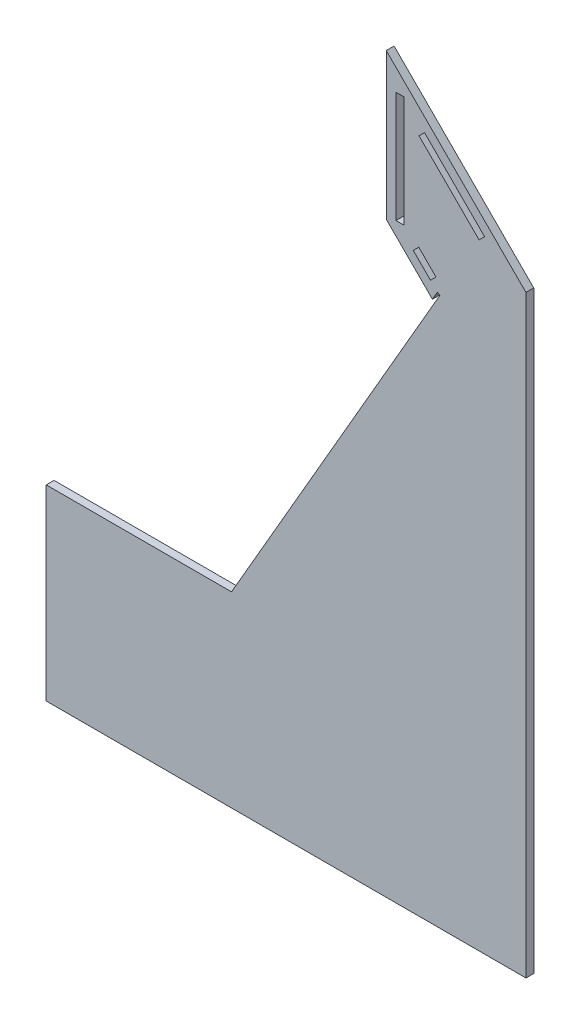
ISO-10303-21;
HEADER;
FILE_DESCRIPTION(('STEP AP214'),'2;1');
FILE_NAME('part.step','',(''),(''),'','','');
FILE_SCHEMA(('AUTOMOTIVE_DESIGN { 1 0 10303 214 1 1 1 1 }'));
ENDSEC;
DATA;
#1=APPLICATION_CONTEXT('core data for automotive mechanical design processes');
#2=APPLICATION_PROTOCOL_DEFINITION('international standard','automotive_design',2000,#1);
#3=PRODUCT_CONTEXT('',#1,'mechanical');
#4=PRODUCT('Part','Part','',(#3));
#5=PRODUCT_RELATED_PRODUCT_CATEGORY('part','',(#4));
#6=PRODUCT_DEFINITION_FORMATION('','',#4);
#7=PRODUCT_DEFINITION_CONTEXT('part definition',#1,'design');
#8=PRODUCT_DEFINITION('design','',#6,#7);
#9=PRODUCT_DEFINITION_SHAPE('','',#8);
#10=(LENGTH_UNIT() NAMED_UNIT(*) SI_UNIT(.MILLI.,.METRE.));
#11=(NAMED_UNIT(*) PLANE_ANGLE_UNIT() SI_UNIT($,.RADIAN.));
#12=(NAMED_UNIT(*) SI_UNIT($,.STERADIAN.) SOLID_ANGLE_UNIT());
#13=UNCERTAINTY_MEASURE_WITH_UNIT(LENGTH_MEASURE(1.E-05),#10,'distance_accuracy_value','');
#14=(GEOMETRIC_REPRESENTATION_CONTEXT(3) GLOBAL_UNCERTAINTY_ASSIGNED_CONTEXT((#13)) GLOBAL_UNIT_ASSIGNED_CONTEXT((#10,
#11,#12)) REPRESENTATION_CONTEXT('',''));
#15=CARTESIAN_POINT('',(0.,0.,0.));
#16=DIRECTION('',(0.,0.,1.));
#17=DIRECTION('',(1.,0.,0.));
#18=AXIS2_PLACEMENT_3D('',#15,#16,#17);
#19=CARTESIAN_POINT('',(56.7634850254111,-32.7724133595535,8.));
#20=DIRECTION('',(0.866025403784497,-0.499999999999898,0.));
#21=DIRECTION('',(0.499999999999898,0.866025403784498,0.));
#22=AXIS2_PLACEMENT_3D('',#19,#20,#21);
#23=PLANE('',#22);
#24=DIRECTION('',(-0.499999999999898,-0.866025403784497,0.));
#25=VECTOR('',#24,1.);
#26=CARTESIAN_POINT('',(56.7634850254111,-32.7724133595535,0.));
#27=LINE('',#26,#25);
#28=CARTESIAN_POINT('',(401.154700619023,563.730669729152,0.));
#29=VERTEX_POINT('',#28);
#30=CARTESIAN_POINT('',(396.053847577291,554.895733098927,0.));
#31=VERTEX_POINT('',#30);
#32=EDGE_CURVE('E261',#29,#31,#27,.T.);
#33=ORIENTED_EDGE('',*,*,#32,.F.);
#34=DIRECTION('',(0.,0.,-1.));
#35=VECTOR('',#34,1.);
#36=CARTESIAN_POINT('',(401.154700619023,563.730669729152,8.));
#37=LINE('',#36,#35);
#38=CARTESIAN_POINT('',(401.154700619023,563.730669729152,8.));
#39=VERTEX_POINT('',#38);
#40=EDGE_CURVE('E11',#39,#29,#37,.T.);
#41=ORIENTED_EDGE('',*,*,#40,.F.);
#42=DIRECTION('',(-0.499999999999898,-0.866025403784497,0.));
#43=VECTOR('',#42,1.);
#44=CARTESIAN_POINT('',(56.7634850254111,-32.7724133595535,8.));
#45=LINE('',#44,#43);
#46=CARTESIAN_POINT('',(396.053847577291,554.895733098927,8.));
#47=VERTEX_POINT('',#46);
#48=EDGE_CURVE('E370',#39,#47,#45,.T.);
#49=ORIENTED_EDGE('',*,*,#48,.T.);
#50=DIRECTION('',(0.,0.,-1.));
#51=VECTOR('',#50,1.);
#52=CARTESIAN_POINT('',(396.053847577291,554.895733098927,8.));
#53=LINE('',#52,#51);
#54=EDGE_CURVE('E60',#47,#31,#53,.T.);
#55=ORIENTED_EDGE('',*,*,#54,.T.);
#56=EDGE_LOOP('',(#33,#41,#49,#55));
#57=FACE_BOUND('',#56,.T.);
#58=ADVANCED_FACE('F41',(#57),#23,.T.);
#59=CARTESIAN_POINT('',(344.39121559369,596.50308308867,8.));
#60=DIRECTION('',(-0.500000000000005,-0.866025403784436,0.));
#61=DIRECTION('',(0.866025403784436,-0.500000000000005,0.));
#62=AXIS2_PLACEMENT_3D('',#59,#60,#61);
#63=PLANE('',#62);
#64=DIRECTION('',(-0.866025403784436,0.500000000000005,0.));
#65=VECTOR('',#64,1.);
#66=CARTESIAN_POINT('',(344.39121559369,596.50308308867,0.));
#67=LINE('',#66,#65);
#68=CARTESIAN_POINT('',(403.752776830379,562.23066972915,0.));
#69=VERTEX_POINT('',#68);
#70=EDGE_CURVE('E263',#69,#29,#67,.T.);
#71=ORIENTED_EDGE('',*,*,#70,.F.);
#72=DIRECTION('',(0.,0.,-1.));
#73=VECTOR('',#72,1.);
#74=CARTESIAN_POINT('',(403.752776830379,562.23066972915,8.));
#75=LINE('',#74,#73);
#76=CARTESIAN_POINT('',(403.752776830379,562.23066972915,8.));
#77=VERTEX_POINT('',#76);
#78=EDGE_CURVE('E51',#77,#69,#75,.T.);
#79=ORIENTED_EDGE('',*,*,#78,.F.);
#80=DIRECTION('',(-0.866025403784436,0.500000000000005,0.));
#81=VECTOR('',#80,1.);
#82=CARTESIAN_POINT('',(344.39121559369,596.50308308867,8.));
#83=LINE('',#82,#81);
#84=EDGE_CURVE('E372',#77,#39,#83,.T.);
#85=ORIENTED_EDGE('',*,*,#84,.T.);
#86=ORIENTED_EDGE('',*,*,#40,.T.);
#87=EDGE_LOOP('',(#71,#79,#85,#86));
#88=FACE_BOUND('',#87,.T.);
#89=ADVANCED_FACE('F404',(#88),#63,.T.);
#90=CARTESIAN_POINT('',(59.3615612366916,-34.2724133595205,8.));
#91=DIRECTION('',(-0.866025403784438,0.500000000000002,0.));
#92=DIRECTION('',(-0.500000000000002,-0.866025403784438,0.));
#93=AXIS2_PLACEMENT_3D('',#90,#91,#92);
#94=PLANE('',#93);
#95=DIRECTION('',(0.500000000000002,0.866025403784438,0.));
#96=VECTOR('',#95,1.);
#97=CARTESIAN_POINT('',(59.3615612366916,-34.2724133595205,0.));
#98=LINE('',#97,#96);
#99=CARTESIAN_POINT('',(190.,192.,0.));
#100=VERTEX_POINT('',#99);
#101=EDGE_CURVE('E266',#100,#69,#98,.T.);
#102=ORIENTED_EDGE('',*,*,#101,.F.);
#103=DIRECTION('',(0.,0.,-1.));
#104=VECTOR('',#103,1.);
#105=CARTESIAN_POINT('',(190.,192.,8.));
#106=LINE('',#105,#104);
#107=CARTESIAN_POINT('',(190.,192.,8.));
#108=VERTEX_POINT('',#107);
#109=EDGE_CURVE('E298',#108,#100,#106,.T.);
#110=ORIENTED_EDGE('',*,*,#109,.F.);
#111=DIRECTION('',(0.500000000000002,0.866025403784438,0.));
#112=VECTOR('',#111,1.);
#113=CARTESIAN_POINT('',(59.3615612366916,-34.2724133595205,8.));
#114=LINE('',#113,#112);
#115=EDGE_CURVE('E375',#108,#77,#114,.T.);
#116=ORIENTED_EDGE('',*,*,#115,.T.);
#117=ORIENTED_EDGE('',*,*,#78,.T.);
#118=EDGE_LOOP('',(#102,#110,#116,#117));
#119=FACE_BOUND('',#118,.T.);
#120=ADVANCED_FACE('F409',(#119),#94,.T.);
#121=CARTESIAN_POINT('',(0.,192.,8.));
#122=DIRECTION('',(0.,1.,0.));
#123=DIRECTION('',(0.,0.,1.));
#124=AXIS2_PLACEMENT_3D('',#121,#122,#123);
#125=PLANE('',#124);
#126=DIRECTION('',(1.,0.,0.));
#127=VECTOR('',#126,1.);
#128=CARTESIAN_POINT('',(0.,192.,0.));
#129=LINE('',#128,#127);
#130=CARTESIAN_POINT('',(0.,192.,0.));
#131=VERTEX_POINT('',#130);
#132=EDGE_CURVE('E269',#131,#100,#129,.T.);
#133=ORIENTED_EDGE('',*,*,#132,.F.);
#134=DIRECTION('',(0.,0.,-1.));
#135=VECTOR('',#134,1.);
#136=CARTESIAN_POINT('',(0.,192.,8.));
#137=LINE('',#136,#135);
#138=CARTESIAN_POINT('',(0.,192.,8.));
#139=VERTEX_POINT('',#138);
#140=EDGE_CURVE('E296',#139,#131,#137,.T.);
#141=ORIENTED_EDGE('',*,*,#140,.F.);
#142=DIRECTION('',(1.,0.,0.));
#143=VECTOR('',#142,1.);
#144=CARTESIAN_POINT('',(0.,192.,8.));
#145=LINE('',#144,#143);
#146=EDGE_CURVE('E378',#139,#108,#145,.T.);
#147=ORIENTED_EDGE('',*,*,#146,.T.);
#148=ORIENTED_EDGE('',*,*,#109,.T.);
#149=EDGE_LOOP('',(#133,#141,#147,#148));
#150=FACE_BOUND('',#149,.T.);
#151=ADVANCED_FACE('F519',(#150),#125,.T.);
#152=CARTESIAN_POINT('',(0.,0.,8.));
#153=DIRECTION('',(-1.,0.,0.));
#154=DIRECTION('',(0.,0.,1.));
#155=AXIS2_PLACEMENT_3D('',#152,#153,#154);
#156=PLANE('',#155);
#157=DIRECTION('',(0.,1.,0.));
#158=VECTOR('',#157,1.);
#159=CARTESIAN_POINT('',(0.,0.,0.));
#160=LINE('',#159,#158);
#161=CARTESIAN_POINT('',(0.,0.,0.));
#162=VERTEX_POINT('',#161);
#163=EDGE_CURVE('E272',#162,#131,#160,.T.);
#164=ORIENTED_EDGE('',*,*,#163,.F.);
#165=DIRECTION('',(0.,0.,-1.));
#166=VECTOR('',#165,1.);
#167=CARTESIAN_POINT('',(0.,0.,8.));
#168=LINE('',#167,#166);
#169=CARTESIAN_POINT('',(0.,0.,8.));
#170=VERTEX_POINT('',#169);
#171=EDGE_CURVE('E294',#170,#162,#168,.T.);
#172=ORIENTED_EDGE('',*,*,#171,.F.);
#173=DIRECTION('',(0.,1.,0.));
#174=VECTOR('',#173,1.);
#175=CARTESIAN_POINT('',(0.,0.,8.));
#176=LINE('',#175,#174);
#177=EDGE_CURVE('E381',#170,#139,#176,.T.);
#178=ORIENTED_EDGE('',*,*,#177,.T.);
#179=ORIENTED_EDGE('',*,*,#140,.T.);
#180=EDGE_LOOP('',(#164,#172,#178,#179));
#181=FACE_BOUND('',#180,.T.);
#182=ADVANCED_FACE('F510',(#181),#156,.T.);
#183=CARTESIAN_POINT('',(0.,0.,8.));
#184=DIRECTION('',(0.,1.,0.));
#185=DIRECTION('',(0.,0.,1.));
#186=AXIS2_PLACEMENT_3D('',#183,#184,#185);
#187=PLANE('',#186);
#188=DIRECTION('',(1.,0.,0.));
#189=VECTOR('',#188,1.);
#190=CARTESIAN_POINT('',(0.,0.,0.));
#191=LINE('',#190,#189);
#192=CARTESIAN_POINT('',(492.,0.,0.));
#193=VERTEX_POINT('',#192);
#194=EDGE_CURVE('E275',#162,#193,#191,.T.);
#195=ORIENTED_EDGE('',*,*,#194,.T.);
#196=DIRECTION('',(0.,0.,-1.));
#197=VECTOR('',#196,1.);
#198=CARTESIAN_POINT('',(492.,0.,8.));
#199=LINE('',#198,#197);
#200=CARTESIAN_POINT('',(492.,0.,8.));
#201=VERTEX_POINT('',#200);
#202=EDGE_CURVE('E292',#201,#193,#199,.T.);
#203=ORIENTED_EDGE('',*,*,#202,.F.);
#204=DIRECTION('',(1.,0.,0.));
#205=VECTOR('',#204,1.);
#206=CARTESIAN_POINT('',(0.,0.,8.));
#207=LINE('',#206,#205);
#208=EDGE_CURVE('E384',#170,#201,#207,.T.);
#209=ORIENTED_EDGE('',*,*,#208,.F.);
#210=ORIENTED_EDGE('',*,*,#171,.T.);
#211=EDGE_LOOP('',(#195,#203,#209,#210));
#212=FACE_BOUND('',#211,.T.);
#213=ADVANCED_FACE('F502',(#212),#187,.F.);
#214=CARTESIAN_POINT('',(492.,0.,8.));
#215=DIRECTION('',(1.,0.,0.));
#216=DIRECTION('',(0.,1.,0.));
#217=AXIS2_PLACEMENT_3D('',#214,#215,#216);
#218=PLANE('',#217);
#219=DIRECTION('',(0.,-1.,0.));
#220=VECTOR('',#219,1.);
#221=CARTESIAN_POINT('',(492.,0.,0.));
#222=LINE('',#221,#220);
#223=CARTESIAN_POINT('',(492.,608.94958067622,0.));
#224=VERTEX_POINT('',#223);
#225=EDGE_CURVE('E278',#224,#193,#222,.T.);
#226=ORIENTED_EDGE('',*,*,#225,.F.);
#227=DIRECTION('',(0.,0.,-1.));
#228=VECTOR('',#227,1.);
#229=CARTESIAN_POINT('',(492.,608.94958067622,8.));
#230=LINE('',#229,#228);
#231=CARTESIAN_POINT('',(492.,608.94958067622,8.));
#232=VERTEX_POINT('',#231);
#233=EDGE_CURVE('E206',#232,#224,#230,.T.);
#234=ORIENTED_EDGE('',*,*,#233,.F.);
#235=DIRECTION('',(0.,-1.,0.));
#236=VECTOR('',#235,1.);
#237=CARTESIAN_POINT('',(492.,0.,8.));
#238=LINE('',#237,#236);
#239=EDGE_CURVE('E216',#232,#201,#238,.T.);
#240=ORIENTED_EDGE('',*,*,#239,.T.);
#241=ORIENTED_EDGE('',*,*,#202,.T.);
#242=EDGE_LOOP('',(#226,#234,#240,#241));
#243=FACE_BOUND('',#242,.T.);
#244=ADVANCED_FACE('F387',(#243),#218,.T.);
#245=CARTESIAN_POINT('',(550.474790338107,550.474790338113,8.));
#246=DIRECTION('',(0.707106781186543,0.707106781186552,0.));
#247=DIRECTION('',(-0.707106781186552,0.707106781186543,0.));
#248=AXIS2_PLACEMENT_3D('',#245,#246,#247);
#249=PLANE('',#248);
#250=DIRECTION('',(0.707106781186552,-0.707106781186543,0.));
#251=VECTOR('',#250,1.);
#252=CARTESIAN_POINT('',(550.474790338107,550.474790338113,0.));
#253=LINE('',#252,#251);
#254=CARTESIAN_POINT('',(348.75252531694,752.197055359277,0.));
#255=VERTEX_POINT('',#254);
#256=EDGE_CURVE('E202',#255,#224,#253,.T.);
#257=ORIENTED_EDGE('',*,*,#256,.F.);
#258=DIRECTION('',(0.,0.,-1.));
#259=VECTOR('',#258,1.);
#260=CARTESIAN_POINT('',(348.75252531694,752.197055359277,8.));
#261=LINE('',#260,#259);
#262=CARTESIAN_POINT('',(348.75252531694,752.197055359277,8.));
#263=VERTEX_POINT('',#262);
#264=EDGE_CURVE('E197',#263,#255,#261,.T.);
#265=ORIENTED_EDGE('',*,*,#264,.F.);
#266=DIRECTION('',(0.707106781186552,-0.707106781186543,0.));
#267=VECTOR('',#266,1.);
#268=CARTESIAN_POINT('',(550.474790338107,550.474790338113,8.));
#269=LINE('',#268,#267);
#270=EDGE_CURVE('E200',#263,#232,#269,.T.);
#271=ORIENTED_EDGE('',*,*,#270,.T.);
#272=ORIENTED_EDGE('',*,*,#233,.T.);
#273=EDGE_LOOP('',(#257,#265,#271,#272));
#274=FACE_BOUND('',#273,.T.);
#275=ADVANCED_FACE('F199',(#274),#249,.T.);
#276=CARTESIAN_POINT('',(348.75252531694,0.,8.));
#277=DIRECTION('',(-1.,0.,0.));
#278=DIRECTION('',(0.,0.,1.));
#279=AXIS2_PLACEMENT_3D('',#276,#277,#278);
#280=PLANE('',#279);
#281=DIRECTION('',(0.,1.,0.));
#282=VECTOR('',#281,1.);
#283=CARTESIAN_POINT('',(348.75252531694,0.,0.));
#284=LINE('',#283,#282);
#285=CARTESIAN_POINT('',(348.752525316941,602.197055359277,0.));
#286=VERTEX_POINT('',#285);
#287=EDGE_CURVE('E282',#286,#255,#284,.T.);
#288=ORIENTED_EDGE('',*,*,#287,.F.);
#289=DIRECTION('',(0.,0.,-1.));
#290=VECTOR('',#289,1.);
#291=CARTESIAN_POINT('',(348.752525316941,602.197055359277,8.));
#292=LINE('',#291,#290);
#293=CARTESIAN_POINT('',(348.752525316941,602.197055359277,8.));
#294=VERTEX_POINT('',#293);
#295=EDGE_CURVE('E127',#294,#286,#292,.T.);
#296=ORIENTED_EDGE('',*,*,#295,.F.);
#297=DIRECTION('',(0.,1.,0.));
#298=VECTOR('',#297,1.);
#299=CARTESIAN_POINT('',(348.75252531694,0.,8.));
#300=LINE('',#299,#298);
#301=EDGE_CURVE('E214',#294,#263,#300,.T.);
#302=ORIENTED_EDGE('',*,*,#301,.T.);
#303=ORIENTED_EDGE('',*,*,#264,.T.);
#304=EDGE_LOOP('',(#288,#296,#302,#303));
#305=FACE_BOUND('',#304,.T.);
#306=ADVANCED_FACE('F218',(#305),#280,.T.);
#307=CARTESIAN_POINT('',(-106.036721896597,106.036721896597,8.));
#308=DIRECTION('',(0.707106781186547,-0.707106781186547,0.));
#309=DIRECTION('',(0.707106781186548,0.707106781186548,0.));
#310=AXIS2_PLACEMENT_3D('',#307,#308,#309);
#311=PLANE('',#310);
#312=DIRECTION('',(-0.707106781186548,-0.707106781186548,0.));
#313=VECTOR('',#312,1.);
#314=CARTESIAN_POINT('',(-106.036721896597,106.036721896597,0.));
#315=LINE('',#314,#313);
#316=CARTESIAN_POINT('',(382.062817526977,594.13626132017,0.));
#317=VERTEX_POINT('',#316);
#318=CARTESIAN_POINT('',(376.405963277485,588.479407070678,0.));
#319=VERTEX_POINT('',#318);
#320=EDGE_CURVE('E249',#317,#319,#315,.T.);
#321=ORIENTED_EDGE('',*,*,#320,.F.);
#322=DIRECTION('',(0.,0.,-1.));
#323=VECTOR('',#322,1.);
#324=CARTESIAN_POINT('',(382.062817526977,594.13626132017,8.));
#325=LINE('',#324,#323);
#326=CARTESIAN_POINT('',(382.062817526977,594.13626132017,8.));
#327=VERTEX_POINT('',#326);
#328=EDGE_CURVE('E289',#327,#317,#325,.T.);
#329=ORIENTED_EDGE('',*,*,#328,.F.);
#330=DIRECTION('',(-0.707106781186548,-0.707106781186548,0.));
#331=VECTOR('',#330,1.);
#332=CARTESIAN_POINT('',(-106.036721896597,106.036721896597,8.));
#333=LINE('',#332,#331);
#334=CARTESIAN_POINT('',(376.405963277485,588.479407070678,8.));
#335=VERTEX_POINT('',#334);
#336=EDGE_CURVE('E358',#327,#335,#333,.T.);
#337=ORIENTED_EDGE('',*,*,#336,.T.);
#338=DIRECTION('',(0.,0.,-1.));
#339=VECTOR('',#338,1.);
#340=CARTESIAN_POINT('',(376.405963277485,588.479407070678,8.));
#341=LINE('',#340,#339);
#342=EDGE_CURVE('E301',#335,#319,#341,.T.);
#343=ORIENTED_EDGE('',*,*,#342,.T.);
#344=EDGE_LOOP('',(#321,#329,#337,#343));
#345=FACE_BOUND('',#344,.T.);
#346=ADVANCED_FACE('F426',(#345),#311,.T.);
#347=CARTESIAN_POINT('',(488.099539423571,488.099539423578,8.));
#348=DIRECTION('',(-0.707106781186542,-0.707106781186553,0.));
#349=DIRECTION('',(0.707106781186553,-0.707106781186542,0.));
#350=AXIS2_PLACEMENT_3D('',#347,#348,#349);
#351=PLANE('',#350);
#352=DIRECTION('',(-0.707106781186553,0.707106781186542,0.));
#353=VECTOR('',#352,1.);
#354=CARTESIAN_POINT('',(488.099539423571,488.099539423578,0.));
#355=LINE('',#354,#353);
#356=CARTESIAN_POINT('',(399.740487056641,576.458591790507,0.));
#357=VERTEX_POINT('',#356);
#358=EDGE_CURVE('E252',#357,#317,#355,.T.);
#359=ORIENTED_EDGE('',*,*,#358,.F.);
#360=DIRECTION('',(0.,0.,-1.));
#361=VECTOR('',#360,1.);
#362=CARTESIAN_POINT('',(399.740487056641,576.458591790507,8.));
#363=LINE('',#362,#361);
#364=CARTESIAN_POINT('',(399.740487056641,576.458591790507,8.));
#365=VERTEX_POINT('',#364);
#366=EDGE_CURVE('E306',#365,#357,#363,.T.);
#367=ORIENTED_EDGE('',*,*,#366,.F.);
#368=DIRECTION('',(-0.707106781186553,0.707106781186542,0.));
#369=VECTOR('',#368,1.);
#370=CARTESIAN_POINT('',(488.099539423571,488.099539423578,8.));
#371=LINE('',#370,#369);
#372=EDGE_CURVE('E361',#365,#327,#371,.T.);
#373=ORIENTED_EDGE('',*,*,#372,.T.);
#374=ORIENTED_EDGE('',*,*,#328,.T.);
#375=EDGE_LOOP('',(#359,#367,#373,#374));
#376=FACE_BOUND('',#375,.T.);
#377=ADVANCED_FACE('F422',(#376),#351,.T.);
#378=CARTESIAN_POINT('',(-88.359052366929,88.3590523669273,8.));
#379=DIRECTION('',(-0.707106781186554,0.707106781186541,0.));
#380=DIRECTION('',(-0.707106781186541,-0.707106781186554,0.));
#381=AXIS2_PLACEMENT_3D('',#378,#379,#380);
#382=PLANE('',#381);
#383=DIRECTION('',(0.707106781186541,0.707106781186554,0.));
#384=VECTOR('',#383,1.);
#385=CARTESIAN_POINT('',(-88.359052366929,88.3590523669273,0.));
#386=LINE('',#385,#384);
#387=CARTESIAN_POINT('',(394.083632807149,570.801737541014,0.));
#388=VERTEX_POINT('',#387);
#389=EDGE_CURVE('E255',#388,#357,#386,.T.);
#390=ORIENTED_EDGE('',*,*,#389,.F.);
#391=DIRECTION('',(0.,0.,-1.));
#392=VECTOR('',#391,1.);
#393=CARTESIAN_POINT('',(394.083632807149,570.801737541014,8.));
#394=LINE('',#393,#392);
#395=CARTESIAN_POINT('',(394.083632807149,570.801737541014,8.));
#396=VERTEX_POINT('',#395);
#397=EDGE_CURVE('E303',#396,#388,#394,.T.);
#398=ORIENTED_EDGE('',*,*,#397,.F.);
#399=DIRECTION('',(0.707106781186541,0.707106781186554,0.));
#400=VECTOR('',#399,1.);
#401=CARTESIAN_POINT('',(-88.359052366929,88.3590523669273,8.));
#402=LINE('',#401,#400);
#403=EDGE_CURVE('E364',#396,#365,#402,.T.);
#404=ORIENTED_EDGE('',*,*,#403,.T.);
#405=ORIENTED_EDGE('',*,*,#366,.T.);
#406=EDGE_LOOP('',(#390,#398,#404,#405));
#407=FACE_BOUND('',#406,.T.);
#408=ADVANCED_FACE('F418',(#407),#382,.T.);
#409=CARTESIAN_POINT('',(0.,606.157076600346,8.));
#410=DIRECTION('',(0.,1.,0.));
#411=DIRECTION('',(0.,0.,1.));
#412=AXIS2_PLACEMENT_3D('',#409,#410,#411);
#413=PLANE('',#412);
#414=DIRECTION('',(1.,0.,0.));
#415=VECTOR('',#414,1.);
#416=CARTESIAN_POINT('',(0.,606.157076600346,0.));
#417=LINE('',#416,#415);
#418=CARTESIAN_POINT('',(358.728293747834,606.157076600346,0.));
#419=VERTEX_POINT('',#418);
#420=CARTESIAN_POINT('',(366.728293747835,606.157076600346,0.));
#421=VERTEX_POINT('',#420);
#422=EDGE_CURVE('E237',#419,#421,#417,.T.);
#423=ORIENTED_EDGE('',*,*,#422,.F.);
#424=DIRECTION('',(0.,0.,-1.));
#425=VECTOR('',#424,1.);
#426=CARTESIAN_POINT('',(358.728293747834,606.157076600346,8.));
#427=LINE('',#426,#425);
#428=CARTESIAN_POINT('',(358.728293747834,606.157076600346,8.));
#429=VERTEX_POINT('',#428);
#430=EDGE_CURVE('E304',#429,#419,#427,.T.);
#431=ORIENTED_EDGE('',*,*,#430,.F.);
#432=DIRECTION('',(1.,0.,0.));
#433=VECTOR('',#432,1.);
#434=CARTESIAN_POINT('',(0.,606.157076600346,8.));
#435=LINE('',#434,#433);
#436=CARTESIAN_POINT('',(366.728293747835,606.157076600346,8.));
#437=VERTEX_POINT('',#436);
#438=EDGE_CURVE('E343',#429,#437,#435,.T.);
#439=ORIENTED_EDGE('',*,*,#438,.T.);
#440=DIRECTION('',(0.,0.,-1.));
#441=VECTOR('',#440,1.);
#442=CARTESIAN_POINT('',(366.728293747835,606.157076600346,8.));
#443=LINE('',#442,#441);
#444=EDGE_CURVE('E309',#437,#421,#443,.T.);
#445=ORIENTED_EDGE('',*,*,#444,.T.);
#446=EDGE_LOOP('',(#423,#431,#439,#445));
#447=FACE_BOUND('',#446,.T.);
#448=ADVANCED_FACE('F421',(#447),#413,.T.);
#449=CARTESIAN_POINT('',(358.728293747833,-1.04871871667693E-12,8.));
#450=DIRECTION('',(1.,0.,0.));
#451=DIRECTION('',(0.,1.,0.));
#452=AXIS2_PLACEMENT_3D('',#449,#450,#451);
#453=PLANE('',#452);
#454=DIRECTION('',(0.,-1.,0.));
#455=VECTOR('',#454,1.);
#456=CARTESIAN_POINT('',(358.728293747833,-1.04871871667693E-12,0.));
#457=LINE('',#456,#455);
#458=CARTESIAN_POINT('',(358.728293747835,720.087076600346,0.));
#459=VERTEX_POINT('',#458);
#460=EDGE_CURVE('E240',#459,#419,#457,.T.);
#461=ORIENTED_EDGE('',*,*,#460,.F.);
#462=DIRECTION('',(0.,0.,-1.));
#463=VECTOR('',#462,1.);
#464=CARTESIAN_POINT('',(358.728293747835,720.087076600346,8.));
#465=LINE('',#464,#463);
#466=CARTESIAN_POINT('',(358.728293747835,720.087076600346,8.));
#467=VERTEX_POINT('',#466);
#468=EDGE_CURVE('E313',#467,#459,#465,.T.);
#469=ORIENTED_EDGE('',*,*,#468,.F.);
#470=DIRECTION('',(0.,-1.,0.));
#471=VECTOR('',#470,1.);
#472=CARTESIAN_POINT('',(358.728293747833,-1.04871871667693E-12,8.));
#473=LINE('',#472,#471);
#474=EDGE_CURVE('E346',#467,#429,#473,.T.);
#475=ORIENTED_EDGE('',*,*,#474,.T.);
#476=ORIENTED_EDGE('',*,*,#430,.T.);
#477=EDGE_LOOP('',(#461,#469,#475,#476));
#478=FACE_BOUND('',#477,.T.);
#479=ADVANCED_FACE('F437',(#478),#453,.T.);
#480=CARTESIAN_POINT('',(0.,720.087076600346,8.));
#481=DIRECTION('',(0.,-1.,0.));
#482=DIRECTION('',(0.,0.,-1.));
#483=AXIS2_PLACEMENT_3D('',#480,#481,#482);
#484=PLANE('',#483);
#485=DIRECTION('',(-1.,0.,0.));
#486=VECTOR('',#485,1.);
#487=CARTESIAN_POINT('',(0.,720.087076600346,0.));
#488=LINE('',#487,#486);
#489=CARTESIAN_POINT('',(366.728293747835,720.087076600346,0.));
#490=VERTEX_POINT('',#489);
#491=EDGE_CURVE('E243',#490,#459,#488,.T.);
#492=ORIENTED_EDGE('',*,*,#491,.F.);
#493=DIRECTION('',(0.,0.,-1.));
#494=VECTOR('',#493,1.);
#495=CARTESIAN_POINT('',(366.728293747835,720.087076600346,8.));
#496=LINE('',#495,#494);
#497=CARTESIAN_POINT('',(366.728293747835,720.087076600346,8.));
#498=VERTEX_POINT('',#497);
#499=EDGE_CURVE('E311',#498,#490,#496,.T.);
#500=ORIENTED_EDGE('',*,*,#499,.F.);
#501=DIRECTION('',(-1.,0.,0.));
#502=VECTOR('',#501,1.);
#503=CARTESIAN_POINT('',(0.,720.087076600346,8.));
#504=LINE('',#503,#502);
#505=EDGE_CURVE('E352',#498,#467,#504,.T.);
#506=ORIENTED_EDGE('',*,*,#505,.T.);
#507=ORIENTED_EDGE('',*,*,#468,.T.);
#508=EDGE_LOOP('',(#492,#500,#506,#507));
#509=FACE_BOUND('',#508,.T.);
#510=ADVANCED_FACE('F434',(#509),#484,.T.);
#511=CARTESIAN_POINT('',(-155.466187990659,155.466187990659,8.));
#512=DIRECTION('',(0.707106781186547,-0.707106781186547,0.));
#513=DIRECTION('',(0.707106781186548,0.707106781186548,0.));
#514=AXIS2_PLACEMENT_3D('',#511,#512,#513);
#515=PLANE('',#514);
#516=DIRECTION('',(-0.707106781186548,-0.707106781186548,0.));
#517=VECTOR('',#516,1.);
#518=CARTESIAN_POINT('',(-155.466187990659,155.466187990659,0.));
#519=LINE('',#518,#517);
#520=CARTESIAN_POINT('',(387.941497183432,698.87387316475,0.));
#521=VERTEX_POINT('',#520);
#522=CARTESIAN_POINT('',(382.284642933939,693.217018915257,0.));
#523=VERTEX_POINT('',#522);
#524=EDGE_CURVE('E225',#521,#523,#519,.T.);
#525=ORIENTED_EDGE('',*,*,#524,.F.);
#526=DIRECTION('',(0.,0.,-1.));
#527=VECTOR('',#526,1.);
#528=CARTESIAN_POINT('',(387.941497183432,698.87387316475,8.));
#529=LINE('',#528,#527);
#530=CARTESIAN_POINT('',(387.941497183432,698.87387316475,8.));
#531=VERTEX_POINT('',#530);
#532=EDGE_CURVE('E45',#531,#521,#529,.T.);
#533=ORIENTED_EDGE('',*,*,#532,.F.);
#534=DIRECTION('',(-0.707106781186548,-0.707106781186548,0.));
#535=VECTOR('',#534,1.);
#536=CARTESIAN_POINT('',(-155.466187990659,155.466187990659,8.));
#537=LINE('',#536,#535);
#538=CARTESIAN_POINT('',(382.284642933939,693.217018915257,8.));
#539=VERTEX_POINT('',#538);
#540=EDGE_CURVE('E287',#531,#539,#537,.T.);
#541=ORIENTED_EDGE('',*,*,#540,.T.);
#542=DIRECTION('',(0.,0.,-1.));
#543=VECTOR('',#542,1.);
#544=CARTESIAN_POINT('',(382.284642933939,693.217018915257,8.));
#545=LINE('',#544,#543);
#546=EDGE_CURVE('E221',#539,#523,#545,.T.);
#547=ORIENTED_EDGE('',*,*,#546,.T.);
#548=EDGE_LOOP('',(#525,#533,#541,#547));
#549=FACE_BOUND('',#548,.T.);
#550=ADVANCED_FACE('F43',(#549),#515,.T.);
#551=CARTESIAN_POINT('',(543.407685174088,543.407685174095,8.));
#552=DIRECTION('',(-0.707106781186543,-0.707106781186552,0.));
#553=DIRECTION('',(0.707106781186552,-0.707106781186543,0.));
#554=AXIS2_PLACEMENT_3D('',#551,#552,#553);
#555=PLANE('',#554);
#556=DIRECTION('',(-0.707106781186552,0.707106781186543,0.));
#557=VECTOR('',#556,1.);
#558=CARTESIAN_POINT('',(543.407685174088,543.407685174095,0.));
#559=LINE('',#558,#557);
#560=CARTESIAN_POINT('',(449.572924231651,637.242446116531,0.));
#561=VERTEX_POINT('',#560);
#562=EDGE_CURVE('E228',#561,#521,#559,.T.);
#563=ORIENTED_EDGE('',*,*,#562,.F.);
#564=DIRECTION('',(0.,0.,-1.));
#565=VECTOR('',#564,1.);
#566=CARTESIAN_POINT('',(449.572924231651,637.242446116531,8.));
#567=LINE('',#566,#565);
#568=CARTESIAN_POINT('',(449.572924231651,637.242446116531,8.));
#569=VERTEX_POINT('',#568);
#570=EDGE_CURVE('E318',#569,#561,#567,.T.);
#571=ORIENTED_EDGE('',*,*,#570,.F.);
#572=DIRECTION('',(-0.707106781186552,0.707106781186543,0.));
#573=VECTOR('',#572,1.);
#574=CARTESIAN_POINT('',(543.407685174088,543.407685174095,8.));
#575=LINE('',#574,#573);
#576=EDGE_CURVE('E327',#569,#531,#575,.T.);
#577=ORIENTED_EDGE('',*,*,#576,.T.);
#578=ORIENTED_EDGE('',*,*,#532,.T.);
#579=EDGE_LOOP('',(#563,#571,#577,#578));
#580=FACE_BOUND('',#579,.T.);
#581=ADVANCED_FACE('F325',(#580),#555,.T.);
#582=CARTESIAN_POINT('',(-93.8347609424331,93.8347609424304,8.));
#583=DIRECTION('',(-0.707106781186558,0.707106781186537,0.));
#584=DIRECTION('',(-0.707106781186537,-0.707106781186558,0.));
#585=AXIS2_PLACEMENT_3D('',#582,#583,#584);
#586=PLANE('',#585);
#587=DIRECTION('',(0.707106781186537,0.707106781186558,0.));
#588=VECTOR('',#587,1.);
#589=CARTESIAN_POINT('',(-93.8347609424331,93.8347609424304,0.));
#590=LINE('',#589,#588);
#591=CARTESIAN_POINT('',(443.916069982159,631.585591867038,0.));
#592=VERTEX_POINT('',#591);
#593=EDGE_CURVE('E231',#592,#561,#590,.T.);
#594=ORIENTED_EDGE('',*,*,#593,.F.);
#595=DIRECTION('',(0.,0.,-1.));
#596=VECTOR('',#595,1.);
#597=CARTESIAN_POINT('',(443.916069982159,631.585591867038,8.));
#598=LINE('',#597,#596);
#599=CARTESIAN_POINT('',(443.916069982159,631.585591867038,8.));
#600=VERTEX_POINT('',#599);
#601=EDGE_CURVE('E317',#600,#592,#598,.T.);
#602=ORIENTED_EDGE('',*,*,#601,.F.);
#603=DIRECTION('',(0.707106781186537,0.707106781186558,0.));
#604=VECTOR('',#603,1.);
#605=CARTESIAN_POINT('',(-93.8347609424331,93.8347609424304,8.));
#606=LINE('',#605,#604);
#607=EDGE_CURVE('E334',#600,#569,#606,.T.);
#608=ORIENTED_EDGE('',*,*,#607,.T.);
#609=ORIENTED_EDGE('',*,*,#570,.T.);
#610=EDGE_LOOP('',(#594,#602,#608,#609));
#611=FACE_BOUND('',#610,.T.);
#612=ADVANCED_FACE('F332',(#611),#586,.T.);
#613=CARTESIAN_POINT('',(482.44268517408,482.442685174084,8.));
#614=DIRECTION('',(0.707106781186544,0.707106781186551,0.));
#615=DIRECTION('',(-0.707106781186551,0.707106781186544,0.));
#616=AXIS2_PLACEMENT_3D('',#613,#614,#615);
#617=PLANE('',#616);
#618=DIRECTION('',(0.707106781186551,-0.707106781186544,0.));
#619=VECTOR('',#618,1.);
#620=CARTESIAN_POINT('',(482.44268517408,482.442685174084,0.));
#621=LINE('',#620,#619);
#622=EDGE_CURVE('E258',#319,#388,#621,.T.);
#623=ORIENTED_EDGE('',*,*,#622,.F.);
#624=ORIENTED_EDGE('',*,*,#342,.F.);
#625=DIRECTION('',(0.707106781186551,-0.707106781186544,0.));
#626=VECTOR('',#625,1.);
#627=CARTESIAN_POINT('',(482.44268517408,482.442685174084,8.));
#628=LINE('',#627,#626);
#629=EDGE_CURVE('E367',#335,#396,#628,.T.);
#630=ORIENTED_EDGE('',*,*,#629,.T.);
#631=ORIENTED_EDGE('',*,*,#397,.T.);
#632=EDGE_LOOP('',(#623,#624,#630,#631));
#633=FACE_BOUND('',#632,.T.);
#634=ADVANCED_FACE('F414',(#633),#617,.T.);
#635=CARTESIAN_POINT('',(366.728293747833,-8.9342182809695E-13,8.));
#636=DIRECTION('',(-1.,0.,0.));
#637=DIRECTION('',(0.,-1.,0.));
#638=AXIS2_PLACEMENT_3D('',#635,#636,#637);
#639=PLANE('',#638);
#640=DIRECTION('',(0.,1.,0.));
#641=VECTOR('',#640,1.);
#642=CARTESIAN_POINT('',(366.728293747833,-8.9342182809695E-13,0.));
#643=LINE('',#642,#641);
#644=EDGE_CURVE('E246',#421,#490,#643,.T.);
#645=ORIENTED_EDGE('',*,*,#644,.F.);
#646=ORIENTED_EDGE('',*,*,#444,.F.);
#647=DIRECTION('',(0.,1.,0.));
#648=VECTOR('',#647,1.);
#649=CARTESIAN_POINT('',(366.728293747833,-8.9342182809695E-13,8.));
#650=LINE('',#649,#648);
#651=EDGE_CURVE('E355',#437,#498,#650,.T.);
#652=ORIENTED_EDGE('',*,*,#651,.T.);
#653=ORIENTED_EDGE('',*,*,#499,.T.);
#654=EDGE_LOOP('',(#645,#646,#652,#653));
#655=FACE_BOUND('',#654,.T.);
#656=ADVANCED_FACE('F399',(#655),#639,.T.);
#657=CARTESIAN_POINT('',(537.750830924596,537.750830924602,8.));
#658=DIRECTION('',(0.707106781186543,0.707106781186552,0.));
#659=DIRECTION('',(-0.707106781186552,0.707106781186543,0.));
#660=AXIS2_PLACEMENT_3D('',#657,#658,#659);
#661=PLANE('',#660);
#662=DIRECTION('',(0.707106781186552,-0.707106781186543,0.));
#663=VECTOR('',#662,1.);
#664=CARTESIAN_POINT('',(537.750830924596,537.750830924602,0.));
#665=LINE('',#664,#663);
#666=EDGE_CURVE('E234',#523,#592,#665,.T.);
#667=ORIENTED_EDGE('',*,*,#666,.F.);
#668=ORIENTED_EDGE('',*,*,#546,.F.);
#669=DIRECTION('',(0.707106781186552,-0.707106781186543,0.));
#670=VECTOR('',#669,1.);
#671=CARTESIAN_POINT('',(537.750830924596,537.750830924602,8.));
#672=LINE('',#671,#670);
#673=EDGE_CURVE('E340',#539,#600,#672,.T.);
#674=ORIENTED_EDGE('',*,*,#673,.T.);
#675=ORIENTED_EDGE('',*,*,#601,.T.);
#676=EDGE_LOOP('',(#667,#668,#674,#675));
#677=FACE_BOUND('',#676,.T.);
#678=ADVANCED_FACE('F342',(#677),#661,.T.);
#679=CARTESIAN_POINT('',(475.474790338107,475.474790338113,8.));
#680=DIRECTION('',(-0.707106781186543,-0.707106781186552,0.));
#681=DIRECTION('',(0.707106781186552,-0.707106781186543,0.));
#682=AXIS2_PLACEMENT_3D('',#679,#680,#681);
#683=PLANE('',#682);
#684=DIRECTION('',(-0.707106781186552,0.707106781186543,0.));
#685=VECTOR('',#684,1.);
#686=CARTESIAN_POINT('',(475.474790338107,475.474790338113,0.));
#687=LINE('',#686,#685);
#688=EDGE_CURVE('E284',#31,#286,#687,.T.);
#689=ORIENTED_EDGE('',*,*,#688,.F.);
#690=ORIENTED_EDGE('',*,*,#54,.F.);
#691=DIRECTION('',(-0.707106781186552,0.707106781186543,0.));
#692=VECTOR('',#691,1.);
#693=CARTESIAN_POINT('',(475.474790338107,475.474790338113,8.));
#694=LINE('',#693,#692);
#695=EDGE_CURVE('E219',#47,#294,#694,.T.);
#696=ORIENTED_EDGE('',*,*,#695,.T.);
#697=ORIENTED_EDGE('',*,*,#295,.T.);
#698=EDGE_LOOP('',(#689,#690,#696,#697));
#699=FACE_BOUND('',#698,.T.);
#700=ADVANCED_FACE('F391',(#699),#683,.T.);
#701=CARTESIAN_POINT('',(0.,0.,8.));
#702=DIRECTION('',(0.,0.,1.));
#703=DIRECTION('',(1.,0.,0.));
#704=AXIS2_PLACEMENT_3D('',#701,#702,#703);
#705=PLANE('',#704);
#706=ORIENTED_EDGE('',*,*,#540,.F.);
#707=ORIENTED_EDGE('',*,*,#576,.F.);
#708=ORIENTED_EDGE('',*,*,#607,.F.);
#709=ORIENTED_EDGE('',*,*,#673,.F.);
#710=EDGE_LOOP('',(#706,#707,#708,#709));
#711=FACE_BOUND('',#710,.T.);
#712=ORIENTED_EDGE('',*,*,#438,.F.);
#713=ORIENTED_EDGE('',*,*,#474,.F.);
#714=ORIENTED_EDGE('',*,*,#505,.F.);
#715=ORIENTED_EDGE('',*,*,#651,.F.);
#716=EDGE_LOOP('',(#712,#713,#714,#715));
#717=FACE_BOUND('',#716,.T.);
#718=ORIENTED_EDGE('',*,*,#336,.F.);
#719=ORIENTED_EDGE('',*,*,#372,.F.);
#720=ORIENTED_EDGE('',*,*,#403,.F.);
#721=ORIENTED_EDGE('',*,*,#629,.F.);
#722=EDGE_LOOP('',(#718,#719,#720,#721));
#723=FACE_BOUND('',#722,.T.);
#724=ORIENTED_EDGE('',*,*,#48,.F.);
#725=ORIENTED_EDGE('',*,*,#84,.F.);
#726=ORIENTED_EDGE('',*,*,#115,.F.);
#727=ORIENTED_EDGE('',*,*,#146,.F.);
#728=ORIENTED_EDGE('',*,*,#177,.F.);
#729=ORIENTED_EDGE('',*,*,#208,.T.);
#730=ORIENTED_EDGE('',*,*,#239,.F.);
#731=ORIENTED_EDGE('',*,*,#270,.F.);
#732=ORIENTED_EDGE('',*,*,#301,.F.);
#733=ORIENTED_EDGE('',*,*,#695,.F.);
#734=EDGE_LOOP('',(#724,#725,#726,#727,#728,#729,#730,#731,#732,#733));
#735=FACE_BOUND('',#734,.T.);
#736=ADVANCED_FACE('F212',(#711,#717,#723,#735),#705,.T.);
#737=CARTESIAN_POINT('',(0.,0.,0.));
#738=DIRECTION('',(0.,0.,1.));
#739=DIRECTION('',(1.,0.,0.));
#740=AXIS2_PLACEMENT_3D('',#737,#738,#739);
#741=PLANE('',#740);
#742=ORIENTED_EDGE('',*,*,#524,.T.);
#743=ORIENTED_EDGE('',*,*,#666,.T.);
#744=ORIENTED_EDGE('',*,*,#593,.T.);
#745=ORIENTED_EDGE('',*,*,#562,.T.);
#746=EDGE_LOOP('',(#742,#743,#744,#745));
#747=FACE_BOUND('',#746,.T.);
#748=ORIENTED_EDGE('',*,*,#422,.T.);
#749=ORIENTED_EDGE('',*,*,#644,.T.);
#750=ORIENTED_EDGE('',*,*,#491,.T.);
#751=ORIENTED_EDGE('',*,*,#460,.T.);
#752=EDGE_LOOP('',(#748,#749,#750,#751));
#753=FACE_BOUND('',#752,.T.);
#754=ORIENTED_EDGE('',*,*,#320,.T.);
#755=ORIENTED_EDGE('',*,*,#622,.T.);
#756=ORIENTED_EDGE('',*,*,#389,.T.);
#757=ORIENTED_EDGE('',*,*,#358,.T.);
#758=EDGE_LOOP('',(#754,#755,#756,#757));
#759=FACE_BOUND('',#758,.T.);
#760=ORIENTED_EDGE('',*,*,#32,.T.);
#761=ORIENTED_EDGE('',*,*,#688,.T.);
#762=ORIENTED_EDGE('',*,*,#287,.T.);
#763=ORIENTED_EDGE('',*,*,#256,.T.);
#764=ORIENTED_EDGE('',*,*,#225,.T.);
#765=ORIENTED_EDGE('',*,*,#194,.F.);
#766=ORIENTED_EDGE('',*,*,#163,.T.);
#767=ORIENTED_EDGE('',*,*,#132,.T.);
#768=ORIENTED_EDGE('',*,*,#101,.T.);
#769=ORIENTED_EDGE('',*,*,#70,.T.);
#770=EDGE_LOOP('',(#760,#761,#762,#763,#764,#765,#766,#767,#768,#769));
#771=FACE_BOUND('',#770,.T.);
#772=ADVANCED_FACE('F330',(#747,#753,#759,#771),#741,.F.);
#773=CLOSED_SHELL('',(#58,#89,#120,#151,#182,#213,#244,#275,#306,#346,#377,#408,#448,#479,#510,
#550,#581,#612,#634,#656,#678,#700,#736,#772));
#774=MANIFOLD_SOLID_BREP('B2',#773);
#775=ADVANCED_BREP_SHAPE_REPRESENTATION('',(#18,#774),#14);
#776=SHAPE_DEFINITION_REPRESENTATION(#9,#775);
ENDSEC;
END-ISO-10303-21;
